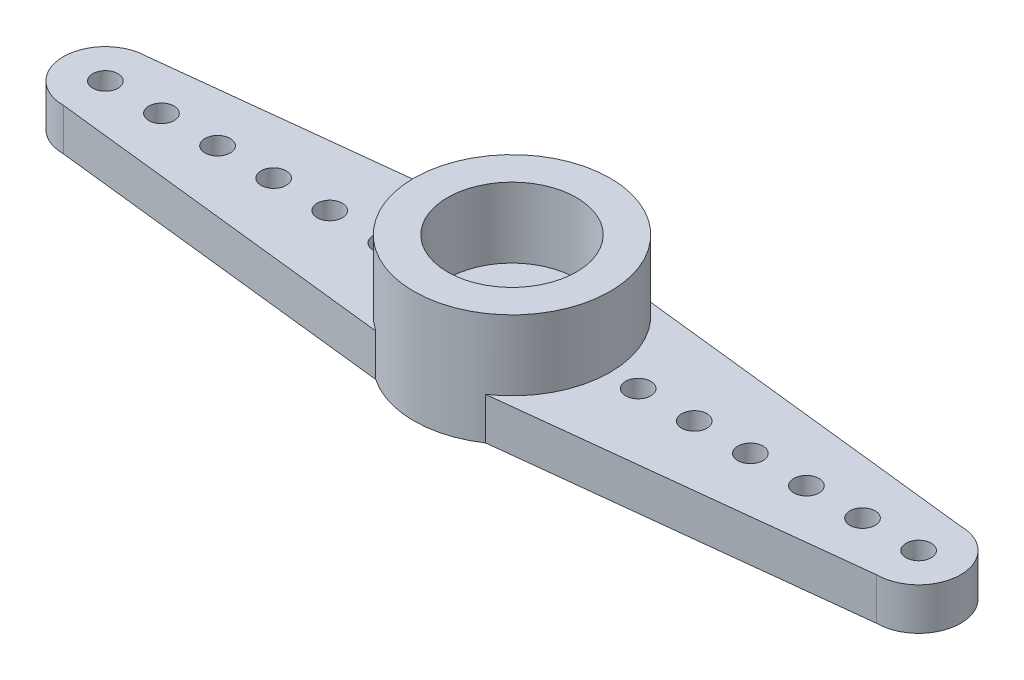
ISO-10303-21;
HEADER;
FILE_DESCRIPTION(('STEP AP214'),'2;1');
FILE_NAME('part.step','',(''),(''),'','','');
FILE_SCHEMA(('AUTOMOTIVE_DESIGN { 1 0 10303 214 1 1 1 1 }'));
ENDSEC;
DATA;
#1=APPLICATION_CONTEXT('core data for automotive mechanical design processes');
#2=APPLICATION_PROTOCOL_DEFINITION('international standard','automotive_design',2000,#1);
#3=PRODUCT_CONTEXT('',#1,'mechanical');
#4=PRODUCT('Part','Part','',(#3));
#5=PRODUCT_RELATED_PRODUCT_CATEGORY('part','',(#4));
#6=PRODUCT_DEFINITION_FORMATION('','',#4);
#7=PRODUCT_DEFINITION_CONTEXT('part definition',#1,'design');
#8=PRODUCT_DEFINITION('design','',#6,#7);
#9=PRODUCT_DEFINITION_SHAPE('','',#8);
#10=(LENGTH_UNIT() NAMED_UNIT(*) SI_UNIT(.MILLI.,.METRE.));
#11=(NAMED_UNIT(*) PLANE_ANGLE_UNIT() SI_UNIT($,.RADIAN.));
#12=(NAMED_UNIT(*) SI_UNIT($,.STERADIAN.) SOLID_ANGLE_UNIT());
#13=UNCERTAINTY_MEASURE_WITH_UNIT(LENGTH_MEASURE(1.E-05),#10,'distance_accuracy_value','');
#14=(GEOMETRIC_REPRESENTATION_CONTEXT(3) GLOBAL_UNCERTAINTY_ASSIGNED_CONTEXT((#13)) GLOBAL_UNIT_ASSIGNED_CONTEXT((#10,
#11,#12)) REPRESENTATION_CONTEXT('',''));
#15=CARTESIAN_POINT('',(0.,0.,0.));
#16=DIRECTION('',(0.,0.,1.));
#17=DIRECTION('',(1.,0.,0.));
#18=AXIS2_PLACEMENT_3D('',#15,#16,#17);
#19=CARTESIAN_POINT('',(0.,1.5,0.));
#20=DIRECTION('',(0.,1.,0.));
#21=DIRECTION('',(0.,0.,1.));
#22=AXIS2_PLACEMENT_3D('',#19,#20,#21);
#23=PLANE('',#22);
#24=CARTESIAN_POINT('',(0.,1.5,0.));
#25=DIRECTION('',(0.,1.,0.));
#26=DIRECTION('',(0.,0.,1.));
#27=AXIS2_PLACEMENT_3D('',#24,#25,#26);
#28=CIRCLE('',#27,3.5);
#29=CARTESIAN_POINT('',(1.95959179422654,1.5,2.9));
#30=VERTEX_POINT('',#29);
#31=CARTESIAN_POINT('',(1.95959179422654,1.5,-2.9));
#32=VERTEX_POINT('',#31);
#33=EDGE_CURVE('E58',#30,#32,#28,.T.);
#34=ORIENTED_EDGE('',*,*,#33,.F.);
#35=DIRECTION('',(0.993826006298256,0.,-0.110949849956001));
#36=VECTOR('',#35,1.);
#37=CARTESIAN_POINT('',(0.343890372897999,1.5,3.08037546726896));
#38=LINE('',#37,#36);
#39=CARTESIAN_POINT('',(14.5,1.5,1.49999999999999));
#40=VERTEX_POINT('',#39);
#41=EDGE_CURVE('E137',#30,#40,#38,.T.);
#42=ORIENTED_EDGE('',*,*,#41,.T.);
#43=CARTESIAN_POINT('',(14.5,1.5,0.));
#44=DIRECTION('',(0.,1.,0.));
#45=DIRECTION('',(0.,0.,1.));
#46=AXIS2_PLACEMENT_3D('',#43,#44,#45);
#47=CIRCLE('',#46,1.5);
#48=CARTESIAN_POINT('',(14.5,1.5,-1.50000000000001));
#49=VERTEX_POINT('',#48);
#50=EDGE_CURVE('E122',#49,#40,#47,.F.);
#51=ORIENTED_EDGE('',*,*,#50,.F.);
#52=DIRECTION('',(0.993826006298256,0.,0.110949849956));
#53=VECTOR('',#52,1.);
#54=CARTESIAN_POINT('',(0.343890372897997,1.5,-3.08037546726897));
#55=LINE('',#54,#53);
#56=EDGE_CURVE('E135',#32,#49,#55,.T.);
#57=ORIENTED_EDGE('',*,*,#56,.F.);
#58=EDGE_LOOP('',(#34,#42,#51,#57));
#59=FACE_BOUND('',#58,.T.);
#60=CARTESIAN_POINT('',(14.5,1.5,0.));
#61=DIRECTION('',(0.,1.,0.));
#62=DIRECTION('',(0.,0.,1.));
#63=AXIS2_PLACEMENT_3D('',#60,#61,#62);
#64=CIRCLE('',#63,0.45);
#65=CARTESIAN_POINT('',(14.5,1.5,0.44999999999999));
#66=VERTEX_POINT('',#65);
#67=EDGE_CURVE('E159',#66,#66,#64,.F.);
#68=ORIENTED_EDGE('',*,*,#67,.T.);
#69=EDGE_LOOP('',(#68));
#70=FACE_BOUND('',#69,.T.);
#71=CARTESIAN_POINT('',(10.5,1.5,0.));
#72=DIRECTION('',(0.,1.,0.));
#73=DIRECTION('',(0.,0.,1.));
#74=AXIS2_PLACEMENT_3D('',#71,#72,#73);
#75=CIRCLE('',#74,0.45);
#76=CARTESIAN_POINT('',(10.5,1.5,0.449999999999993));
#77=VERTEX_POINT('',#76);
#78=EDGE_CURVE('E156',#77,#77,#75,.F.);
#79=ORIENTED_EDGE('',*,*,#78,.T.);
#80=EDGE_LOOP('',(#79));
#81=FACE_BOUND('',#80,.T.);
#82=CARTESIAN_POINT('',(6.5,1.5,0.));
#83=DIRECTION('',(0.,1.,0.));
#84=DIRECTION('',(0.,0.,1.));
#85=AXIS2_PLACEMENT_3D('',#82,#83,#84);
#86=CIRCLE('',#85,0.45);
#87=CARTESIAN_POINT('',(6.5,1.5,0.449999999999997));
#88=VERTEX_POINT('',#87);
#89=EDGE_CURVE('E153',#88,#88,#86,.F.);
#90=ORIENTED_EDGE('',*,*,#89,.T.);
#91=EDGE_LOOP('',(#90));
#92=FACE_BOUND('',#91,.T.);
#93=CARTESIAN_POINT('',(4.5,1.5,0.));
#94=DIRECTION('',(0.,1.,0.));
#95=DIRECTION('',(0.,0.,1.));
#96=AXIS2_PLACEMENT_3D('',#93,#94,#95);
#97=CIRCLE('',#96,0.45);
#98=CARTESIAN_POINT('',(4.5,1.5,0.449999999999997));
#99=VERTEX_POINT('',#98);
#100=EDGE_CURVE('E150',#99,#99,#97,.F.);
#101=ORIENTED_EDGE('',*,*,#100,.T.);
#102=EDGE_LOOP('',(#101));
#103=FACE_BOUND('',#102,.T.);
#104=CARTESIAN_POINT('',(8.5,1.5,0.));
#105=DIRECTION('',(0.,1.,0.));
#106=DIRECTION('',(0.,0.,1.));
#107=AXIS2_PLACEMENT_3D('',#104,#105,#106);
#108=CIRCLE('',#107,0.449999999999999);
#109=CARTESIAN_POINT('',(8.5,1.5,0.449999999999992));
#110=VERTEX_POINT('',#109);
#111=EDGE_CURVE('E144',#110,#110,#108,.F.);
#112=ORIENTED_EDGE('',*,*,#111,.T.);
#113=EDGE_LOOP('',(#112));
#114=FACE_BOUND('',#113,.T.);
#115=CARTESIAN_POINT('',(12.5,1.5,0.));
#116=DIRECTION('',(0.,1.,0.));
#117=DIRECTION('',(0.,0.,1.));
#118=AXIS2_PLACEMENT_3D('',#115,#116,#117);
#119=CIRCLE('',#118,0.45);
#120=CARTESIAN_POINT('',(12.5,1.5,0.449999999999993));
#121=VERTEX_POINT('',#120);
#122=EDGE_CURVE('E141',#121,#121,#119,.F.);
#123=ORIENTED_EDGE('',*,*,#122,.T.);
#124=EDGE_LOOP('',(#123));
#125=FACE_BOUND('',#124,.T.);
#126=ADVANCED_FACE('F47',(#59,#70,#81,#92,#103,#114,#125),#23,.T.);
#127=CARTESIAN_POINT('',(0.,1.5,0.));
#128=DIRECTION('',(0.,1.,0.));
#129=DIRECTION('',(0.,0.,1.));
#130=AXIS2_PLACEMENT_3D('',#127,#128,#129);
#131=CIRCLE('',#130,1.2);
#132=CARTESIAN_POINT('',(0.,1.5,1.2));
#133=VERTEX_POINT('',#132);
#134=EDGE_CURVE('E162',#133,#133,#131,.T.);
#135=ORIENTED_EDGE('',*,*,#134,.F.);
#136=EDGE_LOOP('',(#135));
#137=FACE_BOUND('',#136,.T.);
#138=CARTESIAN_POINT('',(0.,1.5,0.));
#139=DIRECTION('',(0.,1.,0.));
#140=DIRECTION('',(0.,0.,1.));
#141=AXIS2_PLACEMENT_3D('',#138,#139,#140);
#142=CIRCLE('',#141,2.3);
#143=CARTESIAN_POINT('',(0.,1.5,2.3));
#144=VERTEX_POINT('',#143);
#145=EDGE_CURVE('E274',#144,#144,#142,.T.);
#146=ORIENTED_EDGE('',*,*,#145,.T.);
#147=EDGE_LOOP('',(#146));
#148=FACE_BOUND('',#147,.T.);
#149=ADVANCED_FACE('F298',(#137,#148),#23,.T.);
#150=CARTESIAN_POINT('',(-0.343890372897998,1.5,-3.08037546726897));
#151=DIRECTION('',(0.110949849956,0.,0.993826006298256));
#152=DIRECTION('',(0.993826006298256,0.,-0.110949849956));
#153=AXIS2_PLACEMENT_3D('',#150,#151,#152);
#154=PLANE('',#153);
#155=DIRECTION('',(-0.993826006298256,0.,0.110949849956));
#156=VECTOR('',#155,1.);
#157=CARTESIAN_POINT('',(-0.343890372897998,0.,-3.08037546726897));
#158=LINE('',#157,#156);
#159=CARTESIAN_POINT('',(-1.95959179422654,0.,-2.9));
#160=VERTEX_POINT('',#159);
#161=CARTESIAN_POINT('',(-14.5,0.,-1.5));
#162=VERTEX_POINT('',#161);
#163=EDGE_CURVE('E185',#160,#162,#158,.T.);
#164=ORIENTED_EDGE('',*,*,#163,.T.);
#165=DIRECTION('',(0.,-1.,0.));
#166=VECTOR('',#165,1.);
#167=CARTESIAN_POINT('',(-14.5,1.5,-1.5));
#168=LINE('',#167,#166);
#169=CARTESIAN_POINT('',(-14.5,1.5,-1.5));
#170=VERTEX_POINT('',#169);
#171=EDGE_CURVE('E51',#170,#162,#168,.T.);
#172=ORIENTED_EDGE('',*,*,#171,.F.);
#173=DIRECTION('',(-0.993826006298256,0.,0.110949849956));
#174=VECTOR('',#173,1.);
#175=CARTESIAN_POINT('',(-0.343890372897998,1.5,-3.08037546726897));
#176=LINE('',#175,#174);
#177=CARTESIAN_POINT('',(-1.95959179422654,1.5,-2.9));
#178=VERTEX_POINT('',#177);
#179=EDGE_CURVE('E250',#178,#170,#176,.T.);
#180=ORIENTED_EDGE('',*,*,#179,.F.);
#181=DIRECTION('',(0.,-1.,0.));
#182=VECTOR('',#181,1.);
#183=CARTESIAN_POINT('',(-1.95959179422654,1.5,-2.9));
#184=LINE('',#183,#182);
#185=EDGE_CURVE('E165',#178,#160,#184,.T.);
#186=ORIENTED_EDGE('',*,*,#185,.T.);
#187=EDGE_LOOP('',(#164,#172,#180,#186));
#188=FACE_BOUND('',#187,.T.);
#189=ADVANCED_FACE('F237',(#188),#154,.F.);
#190=CARTESIAN_POINT('',(-14.5,1.5,0.));
#191=DIRECTION('',(0.,-1.,0.));
#192=DIRECTION('',(0.,0.,-1.));
#193=AXIS2_PLACEMENT_3D('',#190,#191,#192);
#194=CYLINDRICAL_SURFACE('',#193,1.5);
#195=CARTESIAN_POINT('',(-14.5,0.,0.));
#196=DIRECTION('',(0.,1.,0.));
#197=DIRECTION('',(0.,0.,1.));
#198=AXIS2_PLACEMENT_3D('',#195,#196,#197);
#199=CIRCLE('',#198,1.5);
#200=CARTESIAN_POINT('',(-14.5,0.,1.5));
#201=VERTEX_POINT('',#200);
#202=EDGE_CURVE('E188',#162,#201,#199,.T.);
#203=ORIENTED_EDGE('',*,*,#202,.T.);
#204=DIRECTION('',(0.,-1.,0.));
#205=VECTOR('',#204,1.);
#206=CARTESIAN_POINT('',(-14.5,1.5,1.5));
#207=LINE('',#206,#205);
#208=CARTESIAN_POINT('',(-14.5,1.5,1.5));
#209=VERTEX_POINT('',#208);
#210=EDGE_CURVE('E228',#209,#201,#207,.T.);
#211=ORIENTED_EDGE('',*,*,#210,.F.);
#212=CARTESIAN_POINT('',(-14.5,1.5,0.));
#213=DIRECTION('',(0.,1.,0.));
#214=DIRECTION('',(0.,0.,1.));
#215=AXIS2_PLACEMENT_3D('',#212,#213,#214);
#216=CIRCLE('',#215,1.5);
#217=EDGE_CURVE('E106',#170,#209,#216,.T.);
#218=ORIENTED_EDGE('',*,*,#217,.F.);
#219=ORIENTED_EDGE('',*,*,#171,.T.);
#220=EDGE_LOOP('',(#203,#211,#218,#219));
#221=FACE_BOUND('',#220,.T.);
#222=ADVANCED_FACE('F233',(#221),#194,.T.);
#223=CARTESIAN_POINT('',(-0.343890372897996,1.5,3.08037546726896));
#224=DIRECTION('',(-0.110949849956,0.,0.993826006298256));
#225=DIRECTION('',(0.993826006298256,0.,0.110949849956));
#226=AXIS2_PLACEMENT_3D('',#223,#224,#225);
#227=PLANE('',#226);
#228=DIRECTION('',(-0.993826006298256,0.,-0.110949849956));
#229=VECTOR('',#228,1.);
#230=CARTESIAN_POINT('',(-0.343890372897996,0.,3.08037546726896));
#231=LINE('',#230,#229);
#232=CARTESIAN_POINT('',(-1.95959179422654,0.,2.9));
#233=VERTEX_POINT('',#232);
#234=EDGE_CURVE('E191',#233,#201,#231,.T.);
#235=ORIENTED_EDGE('',*,*,#234,.F.);
#236=DIRECTION('',(0.,-1.,0.));
#237=VECTOR('',#236,1.);
#238=CARTESIAN_POINT('',(-1.95959179422654,1.5,2.9));
#239=LINE('',#238,#237);
#240=CARTESIAN_POINT('',(-1.95959179422654,1.5,2.9));
#241=VERTEX_POINT('',#240);
#242=EDGE_CURVE('E227',#241,#233,#239,.T.);
#243=ORIENTED_EDGE('',*,*,#242,.F.);
#244=DIRECTION('',(-0.993826006298256,0.,-0.110949849956));
#245=VECTOR('',#244,1.);
#246=CARTESIAN_POINT('',(-0.343890372897996,1.5,3.08037546726896));
#247=LINE('',#246,#245);
#248=EDGE_CURVE('E244',#241,#209,#247,.T.);
#249=ORIENTED_EDGE('',*,*,#248,.T.);
#250=ORIENTED_EDGE('',*,*,#210,.T.);
#251=EDGE_LOOP('',(#235,#243,#249,#250));
#252=FACE_BOUND('',#251,.T.);
#253=ADVANCED_FACE('F243',(#252),#227,.T.);
#254=CARTESIAN_POINT('',(0.343890372897999,1.5,3.08037546726896));
#255=DIRECTION('',(-0.110949849956001,0.,-0.993826006298256));
#256=DIRECTION('',(-0.993826006298256,0.,0.110949849956001));
#257=AXIS2_PLACEMENT_3D('',#254,#255,#256);
#258=PLANE('',#257);
#259=DIRECTION('',(0.993826006298256,0.,-0.110949849956001));
#260=VECTOR('',#259,1.);
#261=CARTESIAN_POINT('',(0.343890372897999,0.,3.08037546726896));
#262=LINE('',#261,#260);
#263=CARTESIAN_POINT('',(1.95959179422654,0.,2.9));
#264=VERTEX_POINT('',#263);
#265=CARTESIAN_POINT('',(14.5,0.,1.49999999999999));
#266=VERTEX_POINT('',#265);
#267=EDGE_CURVE('E196',#264,#266,#262,.T.);
#268=ORIENTED_EDGE('',*,*,#267,.T.);
#269=DIRECTION('',(0.,-1.,0.));
#270=VECTOR('',#269,1.);
#271=CARTESIAN_POINT('',(14.5,1.5,1.49999999999999));
#272=LINE('',#271,#270);
#273=EDGE_CURVE('E129',#40,#266,#272,.T.);
#274=ORIENTED_EDGE('',*,*,#273,.F.);
#275=ORIENTED_EDGE('',*,*,#41,.F.);
#276=DIRECTION('',(0.,-1.,0.));
#277=VECTOR('',#276,1.);
#278=CARTESIAN_POINT('',(1.95959179422654,1.5,2.9));
#279=LINE('',#278,#277);
#280=EDGE_CURVE('E224',#30,#264,#279,.T.);
#281=ORIENTED_EDGE('',*,*,#280,.T.);
#282=EDGE_LOOP('',(#268,#274,#275,#281));
#283=FACE_BOUND('',#282,.T.);
#284=ADVANCED_FACE('F363',(#283),#258,.F.);
#285=CARTESIAN_POINT('',(14.5,1.5,0.));
#286=DIRECTION('',(0.,-1.,0.));
#287=DIRECTION('',(0.,0.,-1.));
#288=AXIS2_PLACEMENT_3D('',#285,#286,#287);
#289=CYLINDRICAL_SURFACE('',#288,1.5);
#290=CARTESIAN_POINT('',(14.5,0.,0.));
#291=DIRECTION('',(0.,1.,0.));
#292=DIRECTION('',(0.,0.,1.));
#293=AXIS2_PLACEMENT_3D('',#290,#291,#292);
#294=CIRCLE('',#293,1.5);
#295=CARTESIAN_POINT('',(14.5,0.,-1.50000000000001));
#296=VERTEX_POINT('',#295);
#297=EDGE_CURVE('E124',#296,#266,#294,.F.);
#298=ORIENTED_EDGE('',*,*,#297,.F.);
#299=DIRECTION('',(0.,-1.,0.));
#300=VECTOR('',#299,1.);
#301=CARTESIAN_POINT('',(14.5,1.5,-1.50000000000001));
#302=LINE('',#301,#300);
#303=EDGE_CURVE('E119',#49,#296,#302,.T.);
#304=ORIENTED_EDGE('',*,*,#303,.F.);
#305=ORIENTED_EDGE('',*,*,#50,.T.);
#306=ORIENTED_EDGE('',*,*,#273,.T.);
#307=EDGE_LOOP('',(#298,#304,#305,#306));
#308=FACE_BOUND('',#307,.T.);
#309=ADVANCED_FACE('F121',(#308),#289,.T.);
#310=CARTESIAN_POINT('',(0.343890372897997,1.5,-3.08037546726897));
#311=DIRECTION('',(0.110949849956,0.,-0.993826006298256));
#312=DIRECTION('',(-0.993826006298256,0.,-0.110949849956));
#313=AXIS2_PLACEMENT_3D('',#310,#311,#312);
#314=PLANE('',#313);
#315=DIRECTION('',(0.993826006298256,0.,0.110949849956));
#316=VECTOR('',#315,1.);
#317=CARTESIAN_POINT('',(0.343890372897997,0.,-3.08037546726897));
#318=LINE('',#317,#316);
#319=CARTESIAN_POINT('',(1.95959179422654,0.,-2.9));
#320=VERTEX_POINT('',#319);
#321=EDGE_CURVE('E200',#320,#296,#318,.T.);
#322=ORIENTED_EDGE('',*,*,#321,.F.);
#323=DIRECTION('',(0.,-1.,0.));
#324=VECTOR('',#323,1.);
#325=CARTESIAN_POINT('',(1.95959179422654,1.5,-2.9));
#326=LINE('',#325,#324);
#327=EDGE_CURVE('E94',#32,#320,#326,.T.);
#328=ORIENTED_EDGE('',*,*,#327,.F.);
#329=ORIENTED_EDGE('',*,*,#56,.T.);
#330=ORIENTED_EDGE('',*,*,#303,.T.);
#331=EDGE_LOOP('',(#322,#328,#329,#330));
#332=FACE_BOUND('',#331,.T.);
#333=ADVANCED_FACE('F140',(#332),#314,.T.);
#334=CARTESIAN_POINT('',(14.5,1.5,0.));
#335=DIRECTION('',(0.,-1.,0.));
#336=DIRECTION('',(0.,0.,-1.));
#337=AXIS2_PLACEMENT_3D('',#334,#335,#336);
#338=CYLINDRICAL_SURFACE('',#337,0.45);
#339=ORIENTED_EDGE('',*,*,#67,.F.);
#340=EDGE_LOOP('',(#339));
#341=FACE_BOUND('',#340,.T.);
#342=CARTESIAN_POINT('',(14.5,0.,0.));
#343=DIRECTION('',(0.,1.,0.));
#344=DIRECTION('',(0.,0.,1.));
#345=AXIS2_PLACEMENT_3D('',#342,#343,#344);
#346=CIRCLE('',#345,0.45);
#347=CARTESIAN_POINT('',(14.5,0.,0.44999999999999));
#348=VERTEX_POINT('',#347);
#349=EDGE_CURVE('E217',#348,#348,#346,.F.);
#350=ORIENTED_EDGE('',*,*,#349,.T.);
#351=EDGE_LOOP('',(#350));
#352=FACE_BOUND('',#351,.T.);
#353=ADVANCED_FACE('F333',(#341,#352),#338,.F.);
#354=CARTESIAN_POINT('',(10.5,1.5,0.));
#355=DIRECTION('',(0.,-1.,0.));
#356=DIRECTION('',(0.,0.,-1.));
#357=AXIS2_PLACEMENT_3D('',#354,#355,#356);
#358=CYLINDRICAL_SURFACE('',#357,0.45);
#359=ORIENTED_EDGE('',*,*,#78,.F.);
#360=EDGE_LOOP('',(#359));
#361=FACE_BOUND('',#360,.T.);
#362=CARTESIAN_POINT('',(10.5,0.,0.));
#363=DIRECTION('',(0.,1.,0.));
#364=DIRECTION('',(0.,0.,1.));
#365=AXIS2_PLACEMENT_3D('',#362,#363,#364);
#366=CIRCLE('',#365,0.45);
#367=CARTESIAN_POINT('',(10.5,0.,0.449999999999993));
#368=VERTEX_POINT('',#367);
#369=EDGE_CURVE('E214',#368,#368,#366,.F.);
#370=ORIENTED_EDGE('',*,*,#369,.T.);
#371=EDGE_LOOP('',(#370));
#372=FACE_BOUND('',#371,.T.);
#373=ADVANCED_FACE('F336',(#361,#372),#358,.F.);
#374=CARTESIAN_POINT('',(6.5,1.5,0.));
#375=DIRECTION('',(0.,-1.,0.));
#376=DIRECTION('',(0.,0.,-1.));
#377=AXIS2_PLACEMENT_3D('',#374,#375,#376);
#378=CYLINDRICAL_SURFACE('',#377,0.45);
#379=ORIENTED_EDGE('',*,*,#89,.F.);
#380=EDGE_LOOP('',(#379));
#381=FACE_BOUND('',#380,.T.);
#382=CARTESIAN_POINT('',(6.5,0.,0.));
#383=DIRECTION('',(0.,1.,0.));
#384=DIRECTION('',(0.,0.,1.));
#385=AXIS2_PLACEMENT_3D('',#382,#383,#384);
#386=CIRCLE('',#385,0.45);
#387=CARTESIAN_POINT('',(6.5,0.,0.449999999999997));
#388=VERTEX_POINT('',#387);
#389=EDGE_CURVE('E211',#388,#388,#386,.F.);
#390=ORIENTED_EDGE('',*,*,#389,.T.);
#391=EDGE_LOOP('',(#390));
#392=FACE_BOUND('',#391,.T.);
#393=ADVANCED_FACE('F340',(#381,#392),#378,.F.);
#394=CARTESIAN_POINT('',(4.5,1.5,0.));
#395=DIRECTION('',(0.,-1.,0.));
#396=DIRECTION('',(0.,0.,-1.));
#397=AXIS2_PLACEMENT_3D('',#394,#395,#396);
#398=CYLINDRICAL_SURFACE('',#397,0.45);
#399=ORIENTED_EDGE('',*,*,#100,.F.);
#400=EDGE_LOOP('',(#399));
#401=FACE_BOUND('',#400,.T.);
#402=CARTESIAN_POINT('',(4.5,0.,0.));
#403=DIRECTION('',(0.,1.,0.));
#404=DIRECTION('',(0.,0.,1.));
#405=AXIS2_PLACEMENT_3D('',#402,#403,#404);
#406=CIRCLE('',#405,0.45);
#407=CARTESIAN_POINT('',(4.5,0.,0.449999999999997));
#408=VERTEX_POINT('',#407);
#409=EDGE_CURVE('E208',#408,#408,#406,.F.);
#410=ORIENTED_EDGE('',*,*,#409,.T.);
#411=EDGE_LOOP('',(#410));
#412=FACE_BOUND('',#411,.T.);
#413=ADVANCED_FACE('F344',(#401,#412),#398,.F.);
#414=CARTESIAN_POINT('',(8.5,1.5,0.));
#415=DIRECTION('',(0.,-1.,0.));
#416=DIRECTION('',(0.,0.,-1.));
#417=AXIS2_PLACEMENT_3D('',#414,#415,#416);
#418=CYLINDRICAL_SURFACE('',#417,0.449999999999999);
#419=ORIENTED_EDGE('',*,*,#111,.F.);
#420=EDGE_LOOP('',(#419));
#421=FACE_BOUND('',#420,.T.);
#422=CARTESIAN_POINT('',(8.5,0.,0.));
#423=DIRECTION('',(0.,1.,0.));
#424=DIRECTION('',(0.,0.,1.));
#425=AXIS2_PLACEMENT_3D('',#422,#423,#424);
#426=CIRCLE('',#425,0.449999999999999);
#427=CARTESIAN_POINT('',(8.5,0.,0.449999999999992));
#428=VERTEX_POINT('',#427);
#429=EDGE_CURVE('E205',#428,#428,#426,.F.);
#430=ORIENTED_EDGE('',*,*,#429,.T.);
#431=EDGE_LOOP('',(#430));
#432=FACE_BOUND('',#431,.T.);
#433=ADVANCED_FACE('F348',(#421,#432),#418,.F.);
#434=CARTESIAN_POINT('',(12.5,1.5,0.));
#435=DIRECTION('',(0.,-1.,0.));
#436=DIRECTION('',(0.,0.,-1.));
#437=AXIS2_PLACEMENT_3D('',#434,#435,#436);
#438=CYLINDRICAL_SURFACE('',#437,0.45);
#439=ORIENTED_EDGE('',*,*,#122,.F.);
#440=EDGE_LOOP('',(#439));
#441=FACE_BOUND('',#440,.T.);
#442=CARTESIAN_POINT('',(12.5,0.,0.));
#443=DIRECTION('',(0.,1.,0.));
#444=DIRECTION('',(0.,0.,1.));
#445=AXIS2_PLACEMENT_3D('',#442,#443,#444);
#446=CIRCLE('',#445,0.45);
#447=CARTESIAN_POINT('',(12.5,0.,0.449999999999993));
#448=VERTEX_POINT('',#447);
#449=EDGE_CURVE('E202',#448,#448,#446,.F.);
#450=ORIENTED_EDGE('',*,*,#449,.T.);
#451=EDGE_LOOP('',(#450));
#452=FACE_BOUND('',#451,.T.);
#453=ADVANCED_FACE('F352',(#441,#452),#438,.F.);
#454=CARTESIAN_POINT('',(0.,1.5,0.));
#455=DIRECTION('',(0.,-1.,0.));
#456=DIRECTION('',(0.,0.,-1.));
#457=AXIS2_PLACEMENT_3D('',#454,#455,#456);
#458=CYLINDRICAL_SURFACE('',#457,3.5);
#459=CARTESIAN_POINT('',(0.,0.,0.));
#460=DIRECTION('',(0.,1.,0.));
#461=DIRECTION('',(0.,0.,1.));
#462=AXIS2_PLACEMENT_3D('',#459,#460,#461);
#463=CIRCLE('',#462,3.5);
#464=EDGE_CURVE('E97',#320,#160,#463,.T.);
#465=ORIENTED_EDGE('',*,*,#464,.T.);
#466=ORIENTED_EDGE('',*,*,#185,.F.);
#467=EDGE_CURVE('E12',#178,#241,#28,.T.);
#468=ORIENTED_EDGE('',*,*,#467,.T.);
#469=ORIENTED_EDGE('',*,*,#242,.T.);
#470=EDGE_CURVE('E194',#233,#264,#463,.T.);
#471=ORIENTED_EDGE('',*,*,#470,.T.);
#472=ORIENTED_EDGE('',*,*,#280,.F.);
#473=ORIENTED_EDGE('',*,*,#33,.T.);
#474=ORIENTED_EDGE('',*,*,#327,.T.);
#475=EDGE_LOOP('',(#465,#466,#468,#469,#471,#472,#473,#474));
#476=FACE_BOUND('',#475,.T.);
#477=CARTESIAN_POINT('',(0.,4.,0.));
#478=DIRECTION('',(0.,1.,0.));
#479=DIRECTION('',(0.,0.,1.));
#480=AXIS2_PLACEMENT_3D('',#477,#478,#479);
#481=CIRCLE('',#480,3.5);
#482=CARTESIAN_POINT('',(0.,4.,3.5));
#483=VERTEX_POINT('',#482);
#484=EDGE_CURVE('E170',#483,#483,#481,.T.);
#485=ORIENTED_EDGE('',*,*,#484,.F.);
#486=EDGE_LOOP('',(#485));
#487=FACE_BOUND('',#486,.T.);
#488=ADVANCED_FACE('F248',(#476,#487),#458,.T.);
#489=CARTESIAN_POINT('',(-4.5,1.5,0.));
#490=DIRECTION('',(0.,-1.,0.));
#491=DIRECTION('',(0.,0.,-1.));
#492=AXIS2_PLACEMENT_3D('',#489,#490,#491);
#493=CYLINDRICAL_SURFACE('',#492,0.45);
#494=CARTESIAN_POINT('',(-4.5,1.5,0.));
#495=DIRECTION('',(0.,1.,0.));
#496=DIRECTION('',(0.,0.,1.));
#497=AXIS2_PLACEMENT_3D('',#494,#495,#496);
#498=CIRCLE('',#497,0.45);
#499=CARTESIAN_POINT('',(-4.5,1.5,0.45));
#500=VERTEX_POINT('',#499);
#501=EDGE_CURVE('E251',#500,#500,#498,.T.);
#502=ORIENTED_EDGE('',*,*,#501,.T.);
#503=EDGE_LOOP('',(#502));
#504=FACE_BOUND('',#503,.T.);
#505=CARTESIAN_POINT('',(-4.5,0.,0.));
#506=DIRECTION('',(0.,1.,0.));
#507=DIRECTION('',(0.,0.,1.));
#508=AXIS2_PLACEMENT_3D('',#505,#506,#507);
#509=CIRCLE('',#508,0.45);
#510=CARTESIAN_POINT('',(-4.5,0.,0.45));
#511=VERTEX_POINT('',#510);
#512=EDGE_CURVE('E182',#511,#511,#509,.T.);
#513=ORIENTED_EDGE('',*,*,#512,.F.);
#514=EDGE_LOOP('',(#513));
#515=FACE_BOUND('',#514,.T.);
#516=ADVANCED_FACE('F358',(#504,#515),#493,.F.);
#517=CARTESIAN_POINT('',(-6.5,1.5,0.));
#518=DIRECTION('',(0.,-1.,0.));
#519=DIRECTION('',(0.,0.,-1.));
#520=AXIS2_PLACEMENT_3D('',#517,#518,#519);
#521=CYLINDRICAL_SURFACE('',#520,0.45);
#522=CARTESIAN_POINT('',(-6.5,1.5,0.));
#523=DIRECTION('',(0.,1.,0.));
#524=DIRECTION('',(0.,0.,1.));
#525=AXIS2_PLACEMENT_3D('',#522,#523,#524);
#526=CIRCLE('',#525,0.45);
#527=CARTESIAN_POINT('',(-6.5,1.5,0.45));
#528=VERTEX_POINT('',#527);
#529=EDGE_CURVE('E255',#528,#528,#526,.T.);
#530=ORIENTED_EDGE('',*,*,#529,.T.);
#531=EDGE_LOOP('',(#530));
#532=FACE_BOUND('',#531,.T.);
#533=CARTESIAN_POINT('',(-6.5,0.,0.));
#534=DIRECTION('',(0.,1.,0.));
#535=DIRECTION('',(0.,0.,1.));
#536=AXIS2_PLACEMENT_3D('',#533,#534,#535);
#537=CIRCLE('',#536,0.45);
#538=CARTESIAN_POINT('',(-6.5,0.,0.45));
#539=VERTEX_POINT('',#538);
#540=EDGE_CURVE('E179',#539,#539,#537,.T.);
#541=ORIENTED_EDGE('',*,*,#540,.F.);
#542=EDGE_LOOP('',(#541));
#543=FACE_BOUND('',#542,.T.);
#544=ADVANCED_FACE('F375',(#532,#543),#521,.F.);
#545=CARTESIAN_POINT('',(-8.5,1.5,0.));
#546=DIRECTION('',(0.,-1.,0.));
#547=DIRECTION('',(0.,0.,-1.));
#548=AXIS2_PLACEMENT_3D('',#545,#546,#547);
#549=CYLINDRICAL_SURFACE('',#548,0.45);
#550=CARTESIAN_POINT('',(-8.5,1.5,0.));
#551=DIRECTION('',(0.,1.,0.));
#552=DIRECTION('',(0.,0.,1.));
#553=AXIS2_PLACEMENT_3D('',#550,#551,#552);
#554=CIRCLE('',#553,0.45);
#555=CARTESIAN_POINT('',(-8.5,1.5,0.45));
#556=VERTEX_POINT('',#555);
#557=EDGE_CURVE('E260',#556,#556,#554,.T.);
#558=ORIENTED_EDGE('',*,*,#557,.T.);
#559=EDGE_LOOP('',(#558));
#560=FACE_BOUND('',#559,.T.);
#561=CARTESIAN_POINT('',(-8.5,0.,0.));
#562=DIRECTION('',(0.,1.,0.));
#563=DIRECTION('',(0.,0.,1.));
#564=AXIS2_PLACEMENT_3D('',#561,#562,#563);
#565=CIRCLE('',#564,0.45);
#566=CARTESIAN_POINT('',(-8.5,0.,0.45));
#567=VERTEX_POINT('',#566);
#568=EDGE_CURVE('E176',#567,#567,#565,.T.);
#569=ORIENTED_EDGE('',*,*,#568,.F.);
#570=EDGE_LOOP('',(#569));
#571=FACE_BOUND('',#570,.T.);
#572=ADVANCED_FACE('F379',(#560,#571),#549,.F.);
#573=CARTESIAN_POINT('',(-10.5,1.5,0.));
#574=DIRECTION('',(0.,-1.,0.));
#575=DIRECTION('',(0.,0.,-1.));
#576=AXIS2_PLACEMENT_3D('',#573,#574,#575);
#577=CYLINDRICAL_SURFACE('',#576,0.45);
#578=CARTESIAN_POINT('',(-10.5,1.5,0.));
#579=DIRECTION('',(0.,1.,0.));
#580=DIRECTION('',(0.,0.,1.));
#581=AXIS2_PLACEMENT_3D('',#578,#579,#580);
#582=CIRCLE('',#581,0.45);
#583=CARTESIAN_POINT('',(-10.5,1.5,0.45));
#584=VERTEX_POINT('',#583);
#585=EDGE_CURVE('E263',#584,#584,#582,.T.);
#586=ORIENTED_EDGE('',*,*,#585,.T.);
#587=EDGE_LOOP('',(#586));
#588=FACE_BOUND('',#587,.T.);
#589=CARTESIAN_POINT('',(-10.5,0.,0.));
#590=DIRECTION('',(0.,1.,0.));
#591=DIRECTION('',(0.,0.,1.));
#592=AXIS2_PLACEMENT_3D('',#589,#590,#591);
#593=CIRCLE('',#592,0.45);
#594=CARTESIAN_POINT('',(-10.5,0.,0.45));
#595=VERTEX_POINT('',#594);
#596=EDGE_CURVE('E173',#595,#595,#593,.T.);
#597=ORIENTED_EDGE('',*,*,#596,.F.);
#598=EDGE_LOOP('',(#597));
#599=FACE_BOUND('',#598,.T.);
#600=ADVANCED_FACE('F383',(#588,#599),#577,.F.);
#601=CARTESIAN_POINT('',(-12.5,1.5,0.));
#602=DIRECTION('',(0.,-1.,0.));
#603=DIRECTION('',(0.,0.,-1.));
#604=AXIS2_PLACEMENT_3D('',#601,#602,#603);
#605=CYLINDRICAL_SURFACE('',#604,0.45);
#606=CARTESIAN_POINT('',(-12.5,1.5,0.));
#607=DIRECTION('',(0.,1.,0.));
#608=DIRECTION('',(0.,0.,1.));
#609=AXIS2_PLACEMENT_3D('',#606,#607,#608);
#610=CIRCLE('',#609,0.45);
#611=CARTESIAN_POINT('',(-12.5,1.5,0.45));
#612=VERTEX_POINT('',#611);
#613=EDGE_CURVE('E266',#612,#612,#610,.T.);
#614=ORIENTED_EDGE('',*,*,#613,.T.);
#615=EDGE_LOOP('',(#614));
#616=FACE_BOUND('',#615,.T.);
#617=CARTESIAN_POINT('',(-12.5,0.,0.));
#618=DIRECTION('',(0.,1.,0.));
#619=DIRECTION('',(0.,0.,1.));
#620=AXIS2_PLACEMENT_3D('',#617,#618,#619);
#621=CIRCLE('',#620,0.45);
#622=CARTESIAN_POINT('',(-12.5,0.,0.45));
#623=VERTEX_POINT('',#622);
#624=EDGE_CURVE('E169',#623,#623,#621,.T.);
#625=ORIENTED_EDGE('',*,*,#624,.F.);
#626=EDGE_LOOP('',(#625));
#627=FACE_BOUND('',#626,.T.);
#628=ADVANCED_FACE('F386',(#616,#627),#605,.F.);
#629=CARTESIAN_POINT('',(-14.5,1.5,0.));
#630=DIRECTION('',(0.,-1.,0.));
#631=DIRECTION('',(0.,0.,-1.));
#632=AXIS2_PLACEMENT_3D('',#629,#630,#631);
#633=CYLINDRICAL_SURFACE('',#632,0.45);
#634=CARTESIAN_POINT('',(-14.5,1.5,0.));
#635=DIRECTION('',(0.,1.,0.));
#636=DIRECTION('',(0.,0.,1.));
#637=AXIS2_PLACEMENT_3D('',#634,#635,#636);
#638=CIRCLE('',#637,0.45);
#639=CARTESIAN_POINT('',(-14.5,1.5,0.45));
#640=VERTEX_POINT('',#639);
#641=EDGE_CURVE('E220',#640,#640,#638,.T.);
#642=ORIENTED_EDGE('',*,*,#641,.T.);
#643=EDGE_LOOP('',(#642));
#644=FACE_BOUND('',#643,.T.);
#645=CARTESIAN_POINT('',(-14.5,0.,0.));
#646=DIRECTION('',(0.,1.,0.));
#647=DIRECTION('',(0.,0.,1.));
#648=AXIS2_PLACEMENT_3D('',#645,#646,#647);
#649=CIRCLE('',#648,0.45);
#650=CARTESIAN_POINT('',(-14.5,0.,0.45));
#651=VERTEX_POINT('',#650);
#652=EDGE_CURVE('E166',#651,#651,#649,.T.);
#653=ORIENTED_EDGE('',*,*,#652,.F.);
#654=EDGE_LOOP('',(#653));
#655=FACE_BOUND('',#654,.T.);
#656=ADVANCED_FACE('F49',(#644,#655),#633,.F.);
#657=CARTESIAN_POINT('',(0.,1.5,0.));
#658=DIRECTION('',(0.,-1.,0.));
#659=DIRECTION('',(0.,0.,-1.));
#660=AXIS2_PLACEMENT_3D('',#657,#658,#659);
#661=CYLINDRICAL_SURFACE('',#660,1.2);
#662=CARTESIAN_POINT('',(0.,0.5,0.));
#663=DIRECTION('',(0.,1.,0.));
#664=DIRECTION('',(0.,0.,1.));
#665=AXIS2_PLACEMENT_3D('',#662,#663,#664);
#666=CIRCLE('',#665,1.2);
#667=CARTESIAN_POINT('',(0.,0.5,1.2));
#668=VERTEX_POINT('',#667);
#669=EDGE_CURVE('E283',#668,#668,#666,.T.);
#670=ORIENTED_EDGE('',*,*,#669,.F.);
#671=EDGE_LOOP('',(#670));
#672=FACE_BOUND('',#671,.T.);
#673=ORIENTED_EDGE('',*,*,#134,.T.);
#674=EDGE_LOOP('',(#673));
#675=FACE_BOUND('',#674,.T.);
#676=ADVANCED_FACE('F292',(#672,#675),#661,.F.);
#677=ORIENTED_EDGE('',*,*,#467,.F.);
#678=ORIENTED_EDGE('',*,*,#179,.T.);
#679=ORIENTED_EDGE('',*,*,#217,.T.);
#680=ORIENTED_EDGE('',*,*,#248,.F.);
#681=EDGE_LOOP('',(#677,#678,#679,#680));
#682=FACE_BOUND('',#681,.T.);
#683=ORIENTED_EDGE('',*,*,#641,.F.);
#684=EDGE_LOOP('',(#683));
#685=FACE_BOUND('',#684,.T.);
#686=ORIENTED_EDGE('',*,*,#613,.F.);
#687=EDGE_LOOP('',(#686));
#688=FACE_BOUND('',#687,.T.);
#689=ORIENTED_EDGE('',*,*,#585,.F.);
#690=EDGE_LOOP('',(#689));
#691=FACE_BOUND('',#690,.T.);
#692=ORIENTED_EDGE('',*,*,#557,.F.);
#693=EDGE_LOOP('',(#692));
#694=FACE_BOUND('',#693,.T.);
#695=ORIENTED_EDGE('',*,*,#529,.F.);
#696=EDGE_LOOP('',(#695));
#697=FACE_BOUND('',#696,.T.);
#698=ORIENTED_EDGE('',*,*,#501,.F.);
#699=EDGE_LOOP('',(#698));
#700=FACE_BOUND('',#699,.T.);
#701=ADVANCED_FACE('F245',(#682,#685,#688,#691,#694,#697,#700),#23,.T.);
#702=CARTESIAN_POINT('',(0.,0.,0.));
#703=DIRECTION('',(0.,1.,0.));
#704=DIRECTION('',(0.,0.,1.));
#705=AXIS2_PLACEMENT_3D('',#702,#703,#704);
#706=PLANE('',#705);
#707=CARTESIAN_POINT('',(0.,0.,0.));
#708=DIRECTION('',(0.,1.,0.));
#709=DIRECTION('',(0.,0.,1.));
#710=AXIS2_PLACEMENT_3D('',#707,#708,#709);
#711=CIRCLE('',#710,2.3);
#712=CARTESIAN_POINT('',(0.,0.,2.3));
#713=VERTEX_POINT('',#712);
#714=EDGE_CURVE('E280',#713,#713,#711,.T.);
#715=ORIENTED_EDGE('',*,*,#714,.T.);
#716=EDGE_LOOP('',(#715));
#717=FACE_BOUND('',#716,.T.);
#718=ORIENTED_EDGE('',*,*,#652,.T.);
#719=EDGE_LOOP('',(#718));
#720=FACE_BOUND('',#719,.T.);
#721=ORIENTED_EDGE('',*,*,#624,.T.);
#722=EDGE_LOOP('',(#721));
#723=FACE_BOUND('',#722,.T.);
#724=ORIENTED_EDGE('',*,*,#596,.T.);
#725=EDGE_LOOP('',(#724));
#726=FACE_BOUND('',#725,.T.);
#727=ORIENTED_EDGE('',*,*,#568,.T.);
#728=EDGE_LOOP('',(#727));
#729=FACE_BOUND('',#728,.T.);
#730=ORIENTED_EDGE('',*,*,#540,.T.);
#731=EDGE_LOOP('',(#730));
#732=FACE_BOUND('',#731,.T.);
#733=ORIENTED_EDGE('',*,*,#512,.T.);
#734=EDGE_LOOP('',(#733));
#735=FACE_BOUND('',#734,.T.);
#736=ORIENTED_EDGE('',*,*,#163,.F.);
#737=ORIENTED_EDGE('',*,*,#464,.F.);
#738=ORIENTED_EDGE('',*,*,#321,.T.);
#739=ORIENTED_EDGE('',*,*,#297,.T.);
#740=ORIENTED_EDGE('',*,*,#267,.F.);
#741=ORIENTED_EDGE('',*,*,#470,.F.);
#742=ORIENTED_EDGE('',*,*,#234,.T.);
#743=ORIENTED_EDGE('',*,*,#202,.F.);
#744=EDGE_LOOP('',(#736,#737,#738,#739,#740,#741,#742,#743));
#745=FACE_BOUND('',#744,.T.);
#746=ORIENTED_EDGE('',*,*,#449,.F.);
#747=EDGE_LOOP('',(#746));
#748=FACE_BOUND('',#747,.T.);
#749=ORIENTED_EDGE('',*,*,#429,.F.);
#750=EDGE_LOOP('',(#749));
#751=FACE_BOUND('',#750,.T.);
#752=ORIENTED_EDGE('',*,*,#409,.F.);
#753=EDGE_LOOP('',(#752));
#754=FACE_BOUND('',#753,.T.);
#755=ORIENTED_EDGE('',*,*,#389,.F.);
#756=EDGE_LOOP('',(#755));
#757=FACE_BOUND('',#756,.T.);
#758=ORIENTED_EDGE('',*,*,#369,.F.);
#759=EDGE_LOOP('',(#758));
#760=FACE_BOUND('',#759,.T.);
#761=ORIENTED_EDGE('',*,*,#349,.F.);
#762=EDGE_LOOP('',(#761));
#763=FACE_BOUND('',#762,.T.);
#764=ADVANCED_FACE('F239',(#717,#720,#723,#726,#729,#732,#735,#745,#748,#751,#754,#757,#760,
#763),#706,.F.);
#765=CARTESIAN_POINT('',(0.,4.,0.));
#766=DIRECTION('',(0.,1.,0.));
#767=DIRECTION('',(0.,0.,1.));
#768=AXIS2_PLACEMENT_3D('',#765,#766,#767);
#769=PLANE('',#768);
#770=ORIENTED_EDGE('',*,*,#484,.T.);
#771=EDGE_LOOP('',(#770));
#772=FACE_BOUND('',#771,.T.);
#773=CARTESIAN_POINT('',(0.,4.,0.));
#774=DIRECTION('',(0.,1.,0.));
#775=DIRECTION('',(0.,0.,1.));
#776=AXIS2_PLACEMENT_3D('',#773,#774,#775);
#777=CIRCLE('',#776,2.3);
#778=CARTESIAN_POINT('',(0.,4.,2.3));
#779=VERTEX_POINT('',#778);
#780=EDGE_CURVE('E271',#779,#779,#777,.T.);
#781=ORIENTED_EDGE('',*,*,#780,.F.);
#782=EDGE_LOOP('',(#781));
#783=FACE_BOUND('',#782,.T.);
#784=ADVANCED_FACE('F307',(#772,#783),#769,.T.);
#785=CARTESIAN_POINT('',(0.,4.,0.));
#786=DIRECTION('',(0.,-1.,0.));
#787=DIRECTION('',(0.,0.,-1.));
#788=AXIS2_PLACEMENT_3D('',#785,#786,#787);
#789=CYLINDRICAL_SURFACE('',#788,2.3);
#790=ORIENTED_EDGE('',*,*,#780,.T.);
#791=EDGE_LOOP('',(#790));
#792=FACE_BOUND('',#791,.T.);
#793=ORIENTED_EDGE('',*,*,#145,.F.);
#794=EDGE_LOOP('',(#793));
#795=FACE_BOUND('',#794,.T.);
#796=ADVANCED_FACE('F304',(#792,#795),#789,.F.);
#797=CARTESIAN_POINT('',(0.,0.5,0.));
#798=DIRECTION('',(0.,-1.,0.));
#799=DIRECTION('',(0.,0.,-1.));
#800=AXIS2_PLACEMENT_3D('',#797,#798,#799);
#801=CYLINDRICAL_SURFACE('',#800,2.3);
#802=CARTESIAN_POINT('',(0.,0.5,0.));
#803=DIRECTION('',(0.,1.,0.));
#804=DIRECTION('',(0.,0.,1.));
#805=AXIS2_PLACEMENT_3D('',#802,#803,#804);
#806=CIRCLE('',#805,2.3);
#807=CARTESIAN_POINT('',(0.,0.5,2.3));
#808=VERTEX_POINT('',#807);
#809=EDGE_CURVE('E277',#808,#808,#806,.T.);
#810=ORIENTED_EDGE('',*,*,#809,.T.);
#811=EDGE_LOOP('',(#810));
#812=FACE_BOUND('',#811,.T.);
#813=ORIENTED_EDGE('',*,*,#714,.F.);
#814=EDGE_LOOP('',(#813));
#815=FACE_BOUND('',#814,.T.);
#816=ADVANCED_FACE('F306',(#812,#815),#801,.F.);
#817=CARTESIAN_POINT('',(0.,0.5,0.));
#818=DIRECTION('',(0.,1.,0.));
#819=DIRECTION('',(0.,0.,1.));
#820=AXIS2_PLACEMENT_3D('',#817,#818,#819);
#821=PLANE('',#820);
#822=ORIENTED_EDGE('',*,*,#669,.T.);
#823=EDGE_LOOP('',(#822));
#824=FACE_BOUND('',#823,.T.);
#825=ORIENTED_EDGE('',*,*,#809,.F.);
#826=EDGE_LOOP('',(#825));
#827=FACE_BOUND('',#826,.T.);
#828=ADVANCED_FACE('F289',(#824,#827),#821,.F.);
#829=CLOSED_SHELL('',(#126,#149,#189,#222,#253,#284,#309,#333,#353,#373,#393,#413,#433,#453,
#488,#516,#544,#572,#600,#628,#656,#676,#701,#764,#784,#796,#816,#828));
#830=MANIFOLD_SOLID_BREP('B2',#829);
#831=ADVANCED_BREP_SHAPE_REPRESENTATION('',(#18,#830),#14);
#832=SHAPE_DEFINITION_REPRESENTATION(#9,#831);
ENDSEC;
END-ISO-10303-21;
